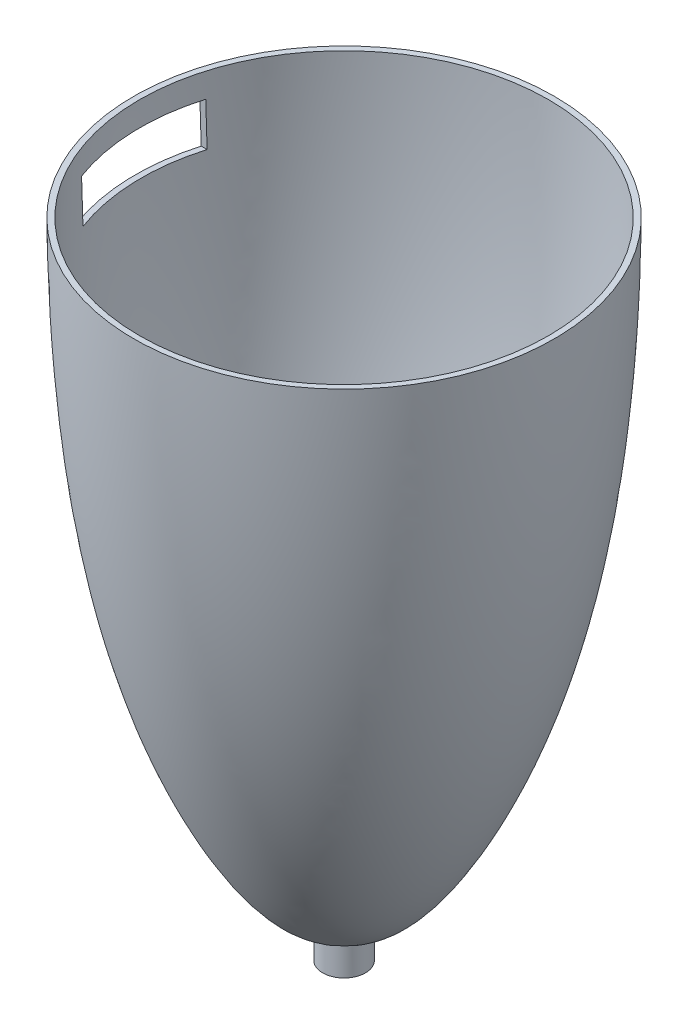
ISO-10303-21;
HEADER;
FILE_DESCRIPTION(('STEP AP214'),'2;1');
FILE_NAME('part.step','',(''),(''),'','','');
FILE_SCHEMA(('AUTOMOTIVE_DESIGN { 1 0 10303 214 1 1 1 1 }'));
ENDSEC;
DATA;
#1=APPLICATION_CONTEXT('core data for automotive mechanical design processes');
#2=APPLICATION_PROTOCOL_DEFINITION('international standard','automotive_design',2000,#1);
#3=PRODUCT_CONTEXT('',#1,'mechanical');
#4=PRODUCT('Part','Part','',(#3));
#5=PRODUCT_RELATED_PRODUCT_CATEGORY('part','',(#4));
#6=PRODUCT_DEFINITION_FORMATION('','',#4);
#7=PRODUCT_DEFINITION_CONTEXT('part definition',#1,'design');
#8=PRODUCT_DEFINITION('design','',#6,#7);
#9=PRODUCT_DEFINITION_SHAPE('','',#8);
#10=(LENGTH_UNIT() NAMED_UNIT(*) SI_UNIT(.MILLI.,.METRE.));
#11=(NAMED_UNIT(*) PLANE_ANGLE_UNIT() SI_UNIT($,.RADIAN.));
#12=(NAMED_UNIT(*) SI_UNIT($,.STERADIAN.) SOLID_ANGLE_UNIT());
#13=UNCERTAINTY_MEASURE_WITH_UNIT(LENGTH_MEASURE(1.E-05),#10,'distance_accuracy_value','');
#14=(GEOMETRIC_REPRESENTATION_CONTEXT(3) GLOBAL_UNCERTAINTY_ASSIGNED_CONTEXT((#13)) GLOBAL_UNIT_ASSIGNED_CONTEXT((#10,
#11,#12)) REPRESENTATION_CONTEXT('',''));
#15=CARTESIAN_POINT('',(0.,0.,0.));
#16=DIRECTION('',(0.,0.,1.));
#17=DIRECTION('',(1.,0.,0.));
#18=AXIS2_PLACEMENT_3D('',#15,#16,#17);
#19=CARTESIAN_POINT('',(0.,10.,0.));
#20=DIRECTION('',(0.,-1.,0.));
#21=DIRECTION('',(0.,0.,-1.));
#22=AXIS2_PLACEMENT_3D('',#19,#20,#21);
#23=CYLINDRICAL_SURFACE('',#22,4.99847796103001);
#24=CARTESIAN_POINT('',(0.,8.46769259750166,0.));
#25=DIRECTION('',(0.,-1.,0.));
#26=DIRECTION('',(0.,0.,-1.));
#27=AXIS2_PLACEMENT_3D('',#24,#25,#26);
#28=CIRCLE('',#27,4.99847796103001);
#29=CARTESIAN_POINT('',(0.,8.46769259750166,-4.99847796103001));
#30=VERTEX_POINT('',#29);
#31=EDGE_CURVE('E170',#30,#30,#28,.T.);
#32=ORIENTED_EDGE('',*,*,#31,.T.);
#33=EDGE_LOOP('',(#32));
#34=FACE_BOUND('',#33,.T.);
#35=CARTESIAN_POINT('',(0.,0.,0.));
#36=DIRECTION('',(0.,1.,0.));
#37=DIRECTION('',(0.,0.,1.));
#38=AXIS2_PLACEMENT_3D('',#35,#36,#37);
#39=CIRCLE('',#38,4.99847796103001);
#40=CARTESIAN_POINT('',(0.,0.,4.99847796103001));
#41=VERTEX_POINT('',#40);
#42=EDGE_CURVE('E179',#41,#41,#39,.T.);
#43=ORIENTED_EDGE('',*,*,#42,.T.);
#44=EDGE_LOOP('',(#43));
#45=FACE_BOUND('',#44,.T.);
#46=ADVANCED_FACE('F38',(#34,#45),#23,.T.);
#47=CARTESIAN_POINT('',(0.,0.,0.));
#48=DIRECTION('',(0.,1.,0.));
#49=DIRECTION('',(0.,0.,1.));
#50=AXIS2_PLACEMENT_3D('',#47,#48,#49);
#51=CYLINDRICAL_SURFACE('',#50,3.99754297401502);
#52=CARTESIAN_POINT('',(0.,8.56564800126533,0.));
#53=DIRECTION('',(0.,-1.,0.));
#54=DIRECTION('',(0.,0.,-1.));
#55=AXIS2_PLACEMENT_3D('',#52,#53,#54);
#56=CIRCLE('',#55,3.99754297401502);
#57=CARTESIAN_POINT('',(0.,8.56564800126533,-3.99754297401502));
#58=VERTEX_POINT('',#57);
#59=EDGE_CURVE('E169',#58,#58,#56,.F.);
#60=ORIENTED_EDGE('',*,*,#59,.T.);
#61=EDGE_LOOP('',(#60));
#62=FACE_BOUND('',#61,.T.);
#63=CARTESIAN_POINT('',(0.,0.,0.));
#64=DIRECTION('',(0.,1.,0.));
#65=DIRECTION('',(0.,0.,1.));
#66=AXIS2_PLACEMENT_3D('',#63,#64,#65);
#67=CIRCLE('',#66,3.99754297401502);
#68=CARTESIAN_POINT('',(0.,0.,3.99754297401502));
#69=VERTEX_POINT('',#68);
#70=EDGE_CURVE('E175',#69,#69,#67,.T.);
#71=ORIENTED_EDGE('',*,*,#70,.F.);
#72=EDGE_LOOP('',(#71));
#73=FACE_BOUND('',#72,.T.);
#74=ADVANCED_FACE('F233',(#62,#73),#51,.F.);
#75=CARTESIAN_POINT('',(0.,0.,0.));
#76=DIRECTION('',(0.,1.,0.));
#77=DIRECTION('',(0.,0.,1.));
#78=AXIS2_PLACEMENT_3D('',#75,#76,#77);
#79=PLANE('',#78);
#80=ORIENTED_EDGE('',*,*,#70,.T.);
#81=EDGE_LOOP('',(#80));
#82=FACE_BOUND('',#81,.T.);
#83=ORIENTED_EDGE('',*,*,#42,.F.);
#84=EDGE_LOOP('',(#83));
#85=FACE_BOUND('',#84,.T.);
#86=ADVANCED_FACE('F238',(#82,#85),#79,.F.);
#87=CARTESIAN_POINT('',(0.,10.,-0.89240872249036));
#88=CARTESIAN_POINT('',(0.,3.34967164125846,-9.40922249490708));
#89=CARTESIAN_POINT('',(0.,41.3826731411071,-37.7143486918916));
#90=CARTESIAN_POINT('',(0.,102.671314041346,-48.5158835253506));
#91=CARTESIAN_POINT('',(0.,150.,-49.));
#92=B_SPLINE_CURVE_WITH_KNOTS('',3,(#87,#88,#89,#90,#91),.UNSPECIFIED.,.F.,.F.,(4,1,4),(0.,
0.41900610630525,1.),.UNSPECIFIED.);
#93=CARTESIAN_POINT('',(0.,10.,0.));
#94=DIRECTION('',(0.,-1.,0.));
#95=AXIS1_PLACEMENT('',#93,#94);
#96=SURFACE_OF_REVOLUTION('',#92,#95);
#97=CARTESIAN_POINT('',(0.,10.,0.));
#98=DIRECTION('',(0.,-1.,0.));
#99=DIRECTION('',(0.,0.,-1.));
#100=AXIS2_PLACEMENT_3D('',#97,#98,#99);
#101=CIRCLE('',#100,0.89240872249036);
#102=CARTESIAN_POINT('',(0.,10.,-0.89240872249036));
#103=VERTEX_POINT('',#102);
#104=EDGE_CURVE('E160',#103,#103,#101,.T.);
#105=ORIENTED_EDGE('',*,*,#104,.F.);
#106=EDGE_LOOP('',(#105));
#107=FACE_BOUND('',#106,.T.);
#108=ORIENTED_EDGE('',*,*,#59,.F.);
#109=EDGE_LOOP('',(#108));
#110=FACE_BOUND('',#109,.T.);
#111=ADVANCED_FACE('F260',(#107,#110),#96,.F.);
#112=CARTESIAN_POINT('',(0.,10.,-1.68843256219736));
#113=DIRECTION('',(0.,1.,0.));
#114=DIRECTION('',(0.,0.,1.));
#115=AXIS2_PLACEMENT_3D('',#112,#113,#114);
#116=PLANE('',#115);
#117=ORIENTED_EDGE('',*,*,#104,.T.);
#118=EDGE_LOOP('',(#117));
#119=FACE_BOUND('',#118,.T.);
#120=CARTESIAN_POINT('',(0.,10.,0.));
#121=DIRECTION('',(0.,-1.,0.));
#122=DIRECTION('',(0.,0.,-1.));
#123=AXIS2_PLACEMENT_3D('',#120,#121,#122);
#124=CIRCLE('',#123,1.68843256219736);
#125=CARTESIAN_POINT('',(0.,10.,-1.68843256219736));
#126=VERTEX_POINT('',#125);
#127=EDGE_CURVE('E156',#126,#126,#124,.T.);
#128=ORIENTED_EDGE('',*,*,#127,.F.);
#129=EDGE_LOOP('',(#128));
#130=FACE_BOUND('',#129,.T.);
#131=ADVANCED_FACE('F143',(#119,#130),#116,.T.);
#132=CARTESIAN_POINT('',(0.,149.972202922966,-47.6746710811132));
#133=CARTESIAN_POINT('',(0.,102.643516964312,-47.1905546064638));
#134=CARTESIAN_POINT('',(0.,43.536797772956,-36.7569080889772));
#135=CARTESIAN_POINT('',(0.,5.87271068246367,-10.0045103782167));
#136=CARTESIAN_POINT('',(0.,10.,-1.68843256219736));
#137=B_SPLINE_CURVE_WITH_KNOTS('',3,(#132,#133,#134,#135,#136),.UNSPECIFIED.,.F.,.F.,(4,1,4),
(0.,0.601600537920514,1.),.UNSPECIFIED.);
#138=CARTESIAN_POINT('',(0.,10.,0.));
#139=DIRECTION('',(0.,-1.,0.));
#140=AXIS1_PLACEMENT('',#138,#139);
#141=SURFACE_OF_REVOLUTION('',#137,#140);
#142=ORIENTED_EDGE('',*,*,#127,.T.);
#143=EDGE_LOOP('',(#142));
#144=FACE_BOUND('',#143,.T.);
#145=CARTESIAN_POINT('',(0.,9.33812263913299,0.));
#146=DIRECTION('',(0.,-1.,0.));
#147=DIRECTION('',(0.,0.,-1.));
#148=AXIS2_PLACEMENT_3D('',#145,#146,#147);
#149=CIRCLE('',#148,3.99754297401501);
#150=CARTESIAN_POINT('',(0.,9.33812263913299,-3.99754297401501));
#151=VERTEX_POINT('',#150);
#152=EDGE_CURVE('E164',#151,#151,#149,.T.);
#153=ORIENTED_EDGE('',*,*,#152,.F.);
#154=EDGE_LOOP('',(#153));
#155=FACE_BOUND('',#154,.T.);
#156=ADVANCED_FACE('F142',(#144,#155),#141,.F.);
#157=CARTESIAN_POINT('',(-45.6952406029215,134.349310201738,16.5848875347457));
#158=CARTESIAN_POINT('',(-45.7130632485825,134.765828036786,16.5848875347457));
#159=CARTESIAN_POINT('',(-45.7303082904169,135.182370539311,16.5848875347457));
#160=CARTESIAN_POINT('',(-45.7636585600083,136.015492352985,16.5848875347457));
#161=CARTESIAN_POINT('',(-45.7797638118687,136.432071663169,16.5848875347457));
#162=CARTESIAN_POINT('',(-45.8108504344541,137.265266470193,16.5848875347457));
#163=CARTESIAN_POINT('',(-45.8258318206006,137.681881966457,16.5848875347457));
#164=CARTESIAN_POINT('',(-45.8546862467844,138.515148574013,16.5848875347457));
#165=CARTESIAN_POINT('',(-45.8685592941356,138.931799685052,16.5848875347457));
#166=CARTESIAN_POINT('',(-45.8952122747427,139.765136557389,16.5848875347457));
#167=CARTESIAN_POINT('',(-45.9079922087778,140.181822318663,16.5848875347457));
#168=CARTESIAN_POINT('',(-45.9324739120971,141.015228491663,16.5848875347457));
#169=CARTESIAN_POINT('',(-45.9441756736504,141.431948903615,16.5848875347457));
#170=CARTESIAN_POINT('',(-45.9665156883175,142.265423979332,16.5848875347457));
#171=CARTESIAN_POINT('',(-45.9771539267317,142.68217864349,16.5848875347457));
#172=CARTESIAN_POINT('',(-45.9973811923547,143.515721863506,16.5848875347457));
#173=CARTESIAN_POINT('',(-46.006970198362,143.932510419879,16.5848875347458));
#174=CARTESIAN_POINT('',(-46.0160416141744,144.349310201738,16.5848875347458));
#175=B_SPLINE_CURVE_WITH_KNOTS('',3,(#157,#158,#159,#160,#161,#162,#163,#164,#165,#166,#167,
#168,#169,#170,#171,#172,#173,#174),.UNSPECIFIED.,.F.,.F.,(4,2,2,2,2,2,2,2,4),(0.,
1.25069644751581,2.5013664384511,3.75201926478466,5.0026638373437,6.25330751839613,
7.50396016628233,8.75463009785826,10.0053252966218),.UNSPECIFIED.);
#176=CARTESIAN_POINT('',(-45.6952406029216,134.349310201738,16.5848875347457));
#177=VERTEX_POINT('',#176);
#178=CARTESIAN_POINT('',(-46.0160416141745,144.349310201738,16.5848875347457));
#179=VERTEX_POINT('',#178);
#180=EDGE_CURVE('E94',#177,#179,#175,.T.);
#181=ORIENTED_EDGE('',*,*,#180,.F.);
#182=CARTESIAN_POINT('',(0.,134.349310201738,0.));
#183=DIRECTION('',(0.,-1.,0.));
#184=DIRECTION('',(0.,0.,-1.));
#185=AXIS2_PLACEMENT_3D('',#182,#183,#184);
#186=CIRCLE('',#185,48.6118659207714);
#187=CARTESIAN_POINT('',(-46.7241721793296,134.349310201738,-13.4151124652543));
#188=VERTEX_POINT('',#187);
#189=EDGE_CURVE('E82',#188,#177,#186,.F.);
#190=ORIENTED_EDGE('',*,*,#189,.F.);
#191=CARTESIAN_POINT('',(-47.0379563535894,144.349310201738,-13.4151124652543));
#192=CARTESIAN_POINT('',(-47.0261240338288,143.793586839388,-13.4151124652543));
#193=CARTESIAN_POINT('',(-47.013391869226,143.237882516571,-13.4151124652543));
#194=CARTESIAN_POINT('',(-46.9860950028158,142.126531723457,-13.4151124652543));
#195=CARTESIAN_POINT('',(-46.9715303432795,141.57088525212,-13.4151124652543));
#196=CARTESIAN_POINT('',(-46.9405352825011,140.459650960482,-13.4151124652543));
#197=CARTESIAN_POINT('',(-46.924104903623,139.904063139557,-13.4151124652543));
#198=CARTESIAN_POINT('',(-46.889344090925,138.792946591898,-13.4151124652543));
#199=CARTESIAN_POINT('',(-46.8710136560215,138.237417865196,-13.4151124652543));
#200=CARTESIAN_POINT('',(-46.8324176680306,137.126421229182,-13.4151124652543));
#201=CARTESIAN_POINT('',(-46.8121520928554,136.570953320635,-13.4151124652543));
#202=CARTESIAN_POINT('',(-46.7696495806857,135.460079724348,-13.4151124652543));
#203=CARTESIAN_POINT('',(-46.7474125968297,134.904674038401,-13.4151124652543));
#204=CARTESIAN_POINT('',(-46.7241721793296,134.349310201738,-13.4151124652543));
#205=B_SPLINE_CURVE_WITH_KNOTS('',3,(#191,#192,#193,#194,#195,#196,#197,#198,#199,#200,#201,
#202,#203,#204),.UNSPECIFIED.,.F.,.F.,(4,2,2,2,2,2,4),(0.,1.66754738752531,3.33505631580584,
5.0025452581168,6.67003515142193,8.33754407975896,10.0050926564031),.UNSPECIFIED.);
#206=CARTESIAN_POINT('',(-47.0379563535894,144.349310201738,-13.4151124652543));
#207=VERTEX_POINT('',#206);
#208=EDGE_CURVE('E88',#207,#188,#205,.T.);
#209=ORIENTED_EDGE('',*,*,#208,.F.);
#210=CARTESIAN_POINT('',(0.,144.349310201738,0.));
#211=DIRECTION('',(0.,-1.,0.));
#212=DIRECTION('',(0.,0.,-1.));
#213=AXIS2_PLACEMENT_3D('',#210,#211,#212);
#214=CIRCLE('',#213,48.9135418915621);
#215=EDGE_CURVE('E103',#179,#207,#214,.T.);
#216=ORIENTED_EDGE('',*,*,#215,.F.);
#217=EDGE_LOOP('',(#181,#190,#209,#216));
#218=FACE_BOUND('',#217,.T.);
#219=CARTESIAN_POINT('',(0.,150.,0.));
#220=DIRECTION('',(0.,-1.,0.));
#221=DIRECTION('',(0.,0.,-1.));
#222=AXIS2_PLACEMENT_3D('',#219,#220,#221);
#223=CIRCLE('',#222,49.);
#224=CARTESIAN_POINT('',(0.,150.,-49.));
#225=VERTEX_POINT('',#224);
#226=EDGE_CURVE('E105',#225,#225,#223,.T.);
#227=ORIENTED_EDGE('',*,*,#226,.T.);
#228=EDGE_LOOP('',(#227));
#229=FACE_BOUND('',#228,.T.);
#230=ORIENTED_EDGE('',*,*,#31,.F.);
#231=EDGE_LOOP('',(#230));
#232=FACE_BOUND('',#231,.T.);
#233=ADVANCED_FACE('F101',(#218,#229,#232),#96,.F.);
#234=CARTESIAN_POINT('',(-44.6052981084587,144.349310201738,16.5848875347457));
#235=CARTESIAN_POINT('',(-44.5962144866316,143.932509580224,16.5848875347457));
#236=CARTESIAN_POINT('',(-44.5866112312117,143.515720243368,16.5848875347457));
#237=CARTESIAN_POINT('',(-44.5663512605645,142.682175675878,16.5848875347457));
#238=CARTESIAN_POINT('',(-44.5556945668007,142.265420444722,16.5848875347457));
#239=CARTESIAN_POINT('',(-44.5333133138963,141.431944452176,16.5848875347457));
#240=CARTESIAN_POINT('',(-44.5215887696396,141.015223690387,16.5848875347457));
#241=CARTESIAN_POINT('',(-44.4970570469649,140.181817039071,16.5848875347457));
#242=CARTESIAN_POINT('',(-44.4842498763765,139.765131149313,16.5848875347457));
#243=CARTESIAN_POINT('',(-44.4575378381595,138.931794240369,16.5848875347457));
#244=CARTESIAN_POINT('',(-44.4436329697383,138.515143221207,16.5848875347457));
#245=CARTESIAN_POINT('',(-44.4147101822589,137.681877029382,16.5848875347457));
#246=CARTESIAN_POINT('',(-44.3996922557952,137.265261856976,16.5848875347457));
#247=CARTESIAN_POINT('',(-44.368527694432,136.432067936188,16.5848875347457));
#248=CARTESIAN_POINT('',(-44.3523810439143,136.015489188389,16.5848875347457));
#249=CARTESIAN_POINT('',(-44.3189429740663,135.182368745279,16.5848875347457));
#250=CARTESIAN_POINT('',(-44.3016515303207,134.765827050947,16.5848875347457));
#251=CARTESIAN_POINT('',(-44.2837799115324,134.349310201738,16.5848875347457));
#252=B_SPLINE_CURVE_WITH_KNOTS('',3,(#234,#235,#236,#237,#238,#239,#240,#241,#242,#243,#244,
#245,#246,#247,#248,#249,#250,#251),.UNSPECIFIED.,.F.,.F.,(4,2,2,2,2,2,2,2,4),(0.,
1.25069851263627,2.50137154800977,3.75202715400541,5.00267371609447,6.25332118131486,
7.50397696808617,8.75465006359225,10.0053498412705),.UNSPECIFIED.);
#253=CARTESIAN_POINT('',(-44.6052981084587,144.349310201738,16.5848875347457));
#254=VERTEX_POINT('',#253);
#255=CARTESIAN_POINT('',(-44.2837799115324,134.349310201738,16.5848875347457));
#256=VERTEX_POINT('',#255);
#257=EDGE_CURVE('E11',#254,#256,#252,.T.);
#258=ORIENTED_EDGE('',*,*,#257,.F.);
#259=CARTESIAN_POINT('',(0.,144.349310201738,0.));
#260=DIRECTION('',(0.,-1.,0.));
#261=DIRECTION('',(0.,0.,-1.));
#262=AXIS2_PLACEMENT_3D('',#259,#260,#261);
#263=CIRCLE('',#262,47.5887708801629);
#264=CARTESIAN_POINT('',(-45.6587984010663,144.349310201738,-13.4151124652543));
#265=VERTEX_POINT('',#264);
#266=EDGE_CURVE('E53',#265,#254,#263,.F.);
#267=ORIENTED_EDGE('',*,*,#266,.F.);
#268=CARTESIAN_POINT('',(-45.3447506922002,134.349310201738,-13.4151124652543));
#269=CARTESIAN_POINT('',(-45.3680221940555,134.904673313402,-13.4151124652543));
#270=CARTESIAN_POINT('',(-45.3902872829102,135.46007845404,-13.4151124652543));
#271=CARTESIAN_POINT('',(-45.4328402858696,136.570951194719,-13.4151124652543));
#272=CARTESIAN_POINT('',(-45.4531282472344,137.12641879295,-13.4151124652543));
#273=CARTESIAN_POINT('',(-45.4917635341013,138.237415032124,-13.4151124652543));
#274=CARTESIAN_POINT('',(-45.5101108818738,138.792943672294,-13.4151124652543));
#275=CARTESIAN_POINT('',(-45.5449002818228,139.9040602565,-13.4151124652543));
#276=CARTESIAN_POINT('',(-45.5613423350961,140.459648200503,-13.4151124652543));
#277=CARTESIAN_POINT('',(-45.5923557345604,141.570882945835,-13.4151124652543));
#278=CARTESIAN_POINT('',(-45.6069270582013,142.126529747792,-13.4151124652543));
#279=CARTESIAN_POINT('',(-45.6342324609936,143.237881404228,-13.4151124652543));
#280=CARTESIAN_POINT('',(-45.6469664975314,143.793586259754,-13.4151124652543));
#281=CARTESIAN_POINT('',(-45.6587984010663,144.349310201738,-13.4151124652543));
#282=B_SPLINE_CURVE_WITH_KNOTS('',3,(#268,#269,#270,#271,#272,#273,#274,#275,#276,#277,#278,
#279,#280,#281),.UNSPECIFIED.,.F.,.F.,(4,2,2,2,2,2,4),(0.,1.66755029771574,3.33506072554189,
5.00255201505613,6.67004234458942,8.33755277235814,10.0051018697164),.UNSPECIFIED.);
#283=CARTESIAN_POINT('',(-45.3447506922002,134.349310201738,-13.4151124652543));
#284=VERTEX_POINT('',#283);
#285=EDGE_CURVE('E198',#284,#265,#282,.T.);
#286=ORIENTED_EDGE('',*,*,#285,.F.);
#287=CARTESIAN_POINT('',(0.,134.349310201738,0.));
#288=DIRECTION('',(0.,-1.,0.));
#289=DIRECTION('',(0.,0.,-1.));
#290=AXIS2_PLACEMENT_3D('',#287,#288,#289);
#291=CIRCLE('',#290,47.2875423107736);
#292=EDGE_CURVE('E187',#256,#284,#291,.T.);
#293=ORIENTED_EDGE('',*,*,#292,.F.);
#294=EDGE_LOOP('',(#258,#267,#286,#293));
#295=FACE_BOUND('',#294,.T.);
#296=CARTESIAN_POINT('',(0.,149.972202922966,0.));
#297=DIRECTION('',(0.,-1.,0.));
#298=DIRECTION('',(0.,0.,-1.));
#299=AXIS2_PLACEMENT_3D('',#296,#297,#298);
#300=CIRCLE('',#299,47.6746710811132);
#301=CARTESIAN_POINT('',(0.,149.972202922966,-47.6746710811132));
#302=VERTEX_POINT('',#301);
#303=EDGE_CURVE('E110',#302,#302,#300,.T.);
#304=ORIENTED_EDGE('',*,*,#303,.F.);
#305=EDGE_LOOP('',(#304));
#306=FACE_BOUND('',#305,.T.);
#307=CARTESIAN_POINT('',(0.,9.32324301994993,0.));
#308=DIRECTION('',(0.,-1.,0.));
#309=DIRECTION('',(0.,0.,-1.));
#310=AXIS2_PLACEMENT_3D('',#307,#308,#309);
#311=CIRCLE('',#310,4.99847796103001);
#312=CARTESIAN_POINT('',(0.,9.32324301994993,-4.99847796103001));
#313=VERTEX_POINT('',#312);
#314=EDGE_CURVE('E165',#313,#313,#311,.F.);
#315=ORIENTED_EDGE('',*,*,#314,.F.);
#316=EDGE_LOOP('',(#315));
#317=FACE_BOUND('',#316,.T.);
#318=ADVANCED_FACE('F137',(#295,#306,#317),#141,.F.);
#319=CARTESIAN_POINT('',(0.,150.,0.));
#320=DIRECTION('',(0.,1.,0.));
#321=DIRECTION('',(0.,0.,1.));
#322=AXIS2_PLACEMENT_3D('',#319,#320,#321);
#323=CONICAL_SURFACE('',#322,49.,1.5498256818749);
#324=ORIENTED_EDGE('',*,*,#303,.T.);
#325=EDGE_LOOP('',(#324));
#326=FACE_BOUND('',#325,.T.);
#327=ORIENTED_EDGE('',*,*,#226,.F.);
#328=EDGE_LOOP('',(#327));
#329=FACE_BOUND('',#328,.T.);
#330=ADVANCED_FACE('F134',(#326,#329),#323,.F.);
#331=ORIENTED_EDGE('',*,*,#314,.T.);
#332=EDGE_LOOP('',(#331));
#333=FACE_BOUND('',#332,.T.);
#334=CARTESIAN_POINT('',(0.,10.,0.));
#335=DIRECTION('',(0.,1.,0.));
#336=DIRECTION('',(0.,0.,1.));
#337=AXIS2_PLACEMENT_3D('',#334,#335,#336);
#338=CIRCLE('',#337,4.99847796103001);
#339=CARTESIAN_POINT('',(0.,10.,4.99847796103001));
#340=VERTEX_POINT('',#339);
#341=EDGE_CURVE('E183',#340,#340,#338,.T.);
#342=ORIENTED_EDGE('',*,*,#341,.F.);
#343=EDGE_LOOP('',(#342));
#344=FACE_BOUND('',#343,.T.);
#345=ADVANCED_FACE('F40',(#333,#344),#23,.T.);
#346=CARTESIAN_POINT('',(0.,10.,0.));
#347=DIRECTION('',(0.,1.,0.));
#348=DIRECTION('',(0.,0.,1.));
#349=AXIS2_PLACEMENT_3D('',#346,#347,#348);
#350=PLANE('',#349);
#351=CARTESIAN_POINT('',(0.,10.,0.));
#352=DIRECTION('',(0.,1.,0.));
#353=DIRECTION('',(0.,0.,1.));
#354=AXIS2_PLACEMENT_3D('',#351,#352,#353);
#355=CIRCLE('',#354,3.99754297401502);
#356=CARTESIAN_POINT('',(0.,10.,3.99754297401502));
#357=VERTEX_POINT('',#356);
#358=EDGE_CURVE('E174',#357,#357,#355,.T.);
#359=ORIENTED_EDGE('',*,*,#358,.F.);
#360=EDGE_LOOP('',(#359));
#361=FACE_BOUND('',#360,.T.);
#362=ORIENTED_EDGE('',*,*,#341,.T.);
#363=EDGE_LOOP('',(#362));
#364=FACE_BOUND('',#363,.T.);
#365=ADVANCED_FACE('F242',(#361,#364),#350,.T.);
#366=ORIENTED_EDGE('',*,*,#152,.T.);
#367=EDGE_LOOP('',(#366));
#368=FACE_BOUND('',#367,.T.);
#369=ORIENTED_EDGE('',*,*,#358,.T.);
#370=EDGE_LOOP('',(#369));
#371=FACE_BOUND('',#370,.T.);
#372=ADVANCED_FACE('F132',(#368,#371),#51,.F.);
#373=CARTESIAN_POINT('',(-100.,144.349310201738,16.5848875347457));
#374=DIRECTION('',(0.,0.,1.));
#375=DIRECTION('',(1.,0.,0.));
#376=AXIS2_PLACEMENT_3D('',#373,#374,#375);
#377=PLANE('',#376);
#378=ORIENTED_EDGE('',*,*,#180,.T.);
#379=DIRECTION('',(1.,0.,0.));
#380=VECTOR('',#379,1.);
#381=CARTESIAN_POINT('',(-100.,144.349310201738,16.5848875347457));
#382=LINE('',#381,#380);
#383=EDGE_CURVE('E89',#179,#254,#382,.T.);
#384=ORIENTED_EDGE('',*,*,#383,.T.);
#385=ORIENTED_EDGE('',*,*,#257,.T.);
#386=DIRECTION('',(1.,0.,0.));
#387=VECTOR('',#386,1.);
#388=CARTESIAN_POINT('',(-100.,134.349310201738,16.5848875347457));
#389=LINE('',#388,#387);
#390=EDGE_CURVE('E65',#177,#256,#389,.T.);
#391=ORIENTED_EDGE('',*,*,#390,.F.);
#392=EDGE_LOOP('',(#378,#384,#385,#391));
#393=FACE_BOUND('',#392,.T.);
#394=ADVANCED_FACE('F92',(#393),#377,.F.);
#395=CARTESIAN_POINT('',(-100.,144.349310201738,16.5848875347457));
#396=DIRECTION('',(0.,1.,0.));
#397=DIRECTION('',(0.,0.,1.));
#398=AXIS2_PLACEMENT_3D('',#395,#396,#397);
#399=PLANE('',#398);
#400=ORIENTED_EDGE('',*,*,#215,.T.);
#401=DIRECTION('',(1.,0.,0.));
#402=VECTOR('',#401,1.);
#403=CARTESIAN_POINT('',(-100.,144.349310201738,-13.4151124652543));
#404=LINE('',#403,#402);
#405=EDGE_CURVE('E218',#207,#265,#404,.T.);
#406=ORIENTED_EDGE('',*,*,#405,.T.);
#407=ORIENTED_EDGE('',*,*,#266,.T.);
#408=ORIENTED_EDGE('',*,*,#383,.F.);
#409=EDGE_LOOP('',(#400,#406,#407,#408));
#410=FACE_BOUND('',#409,.T.);
#411=ADVANCED_FACE('F131',(#410),#399,.F.);
#412=CARTESIAN_POINT('',(-100.,144.349310201738,-13.4151124652543));
#413=DIRECTION('',(0.,0.,-1.));
#414=DIRECTION('',(0.,1.,0.));
#415=AXIS2_PLACEMENT_3D('',#412,#413,#414);
#416=PLANE('',#415);
#417=ORIENTED_EDGE('',*,*,#208,.T.);
#418=DIRECTION('',(1.,0.,0.));
#419=VECTOR('',#418,1.);
#420=CARTESIAN_POINT('',(-100.,134.349310201738,-13.4151124652543));
#421=LINE('',#420,#419);
#422=EDGE_CURVE('E60',#188,#284,#421,.T.);
#423=ORIENTED_EDGE('',*,*,#422,.T.);
#424=ORIENTED_EDGE('',*,*,#285,.T.);
#425=ORIENTED_EDGE('',*,*,#405,.F.);
#426=EDGE_LOOP('',(#417,#423,#424,#425));
#427=FACE_BOUND('',#426,.T.);
#428=ADVANCED_FACE('F204',(#427),#416,.F.);
#429=CARTESIAN_POINT('',(-100.,134.349310201738,16.5848875347457));
#430=DIRECTION('',(0.,-1.,0.));
#431=DIRECTION('',(0.,0.,-1.));
#432=AXIS2_PLACEMENT_3D('',#429,#430,#431);
#433=PLANE('',#432);
#434=ORIENTED_EDGE('',*,*,#189,.T.);
#435=ORIENTED_EDGE('',*,*,#390,.T.);
#436=ORIENTED_EDGE('',*,*,#292,.T.);
#437=ORIENTED_EDGE('',*,*,#422,.F.);
#438=EDGE_LOOP('',(#434,#435,#436,#437));
#439=FACE_BOUND('',#438,.T.);
#440=ADVANCED_FACE('F83',(#439),#433,.F.);
#441=CLOSED_SHELL('',(#46,#74,#86,#111,#131,#156,#233,#318,#330,#345,#365,#372,#394,#411,#428,#440));
#442=MANIFOLD_SOLID_BREP('B2',#441);
#443=ADVANCED_BREP_SHAPE_REPRESENTATION('',(#18,#442),#14);
#444=SHAPE_DEFINITION_REPRESENTATION(#9,#443);
ENDSEC;
END-ISO-10303-21;
